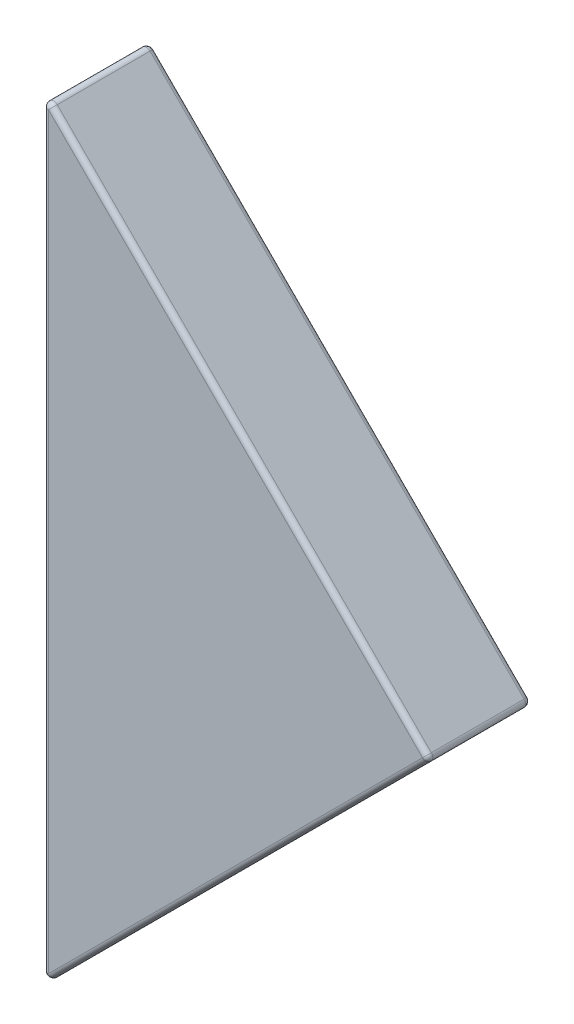
ISO-10303-21;
HEADER;
FILE_DESCRIPTION(('STEP AP214'),'2;1');
FILE_NAME('part.step','',(''),(''),'','','');
FILE_SCHEMA(('AUTOMOTIVE_DESIGN { 1 0 10303 214 1 1 1 1 }'));
ENDSEC;
DATA;
#1=APPLICATION_CONTEXT('core data for automotive mechanical design processes');
#2=APPLICATION_PROTOCOL_DEFINITION('international standard','automotive_design',2000,#1);
#3=PRODUCT_CONTEXT('',#1,'mechanical');
#4=PRODUCT('Part','Part','',(#3));
#5=PRODUCT_RELATED_PRODUCT_CATEGORY('part','',(#4));
#6=PRODUCT_DEFINITION_FORMATION('','',#4);
#7=PRODUCT_DEFINITION_CONTEXT('part definition',#1,'design');
#8=PRODUCT_DEFINITION('design','',#6,#7);
#9=PRODUCT_DEFINITION_SHAPE('','',#8);
#10=(LENGTH_UNIT() NAMED_UNIT(*) SI_UNIT(.MILLI.,.METRE.));
#11=(NAMED_UNIT(*) PLANE_ANGLE_UNIT() SI_UNIT($,.RADIAN.));
#12=(NAMED_UNIT(*) SI_UNIT($,.STERADIAN.) SOLID_ANGLE_UNIT());
#13=UNCERTAINTY_MEASURE_WITH_UNIT(LENGTH_MEASURE(1.E-05),#10,'distance_accuracy_value','');
#14=(GEOMETRIC_REPRESENTATION_CONTEXT(3) GLOBAL_UNCERTAINTY_ASSIGNED_CONTEXT((#13)) GLOBAL_UNIT_ASSIGNED_CONTEXT((#10,
#11,#12)) REPRESENTATION_CONTEXT('',''));
#15=CARTESIAN_POINT('',(0.,0.,0.));
#16=DIRECTION('',(0.,0.,1.));
#17=DIRECTION('',(1.,0.,0.));
#18=AXIS2_PLACEMENT_3D('',#15,#16,#17);
#19=CARTESIAN_POINT('',(0.,0.,10.));
#20=DIRECTION('',(1.,0.,0.));
#21=DIRECTION('',(0.,0.,-1.));
#22=AXIS2_PLACEMENT_3D('',#19,#20,#21);
#23=PLANE('',#22);
#24=DIRECTION('',(0.,-1.,0.));
#25=VECTOR('',#24,1.);
#26=CARTESIAN_POINT('',(0.,0.,0.5));
#27=LINE('',#26,#25);
#28=CARTESIAN_POINT('',(0.,73.7928932188134,0.5));
#29=VERTEX_POINT('',#28);
#30=CARTESIAN_POINT('',(0.,1.20710678118655,0.5));
#31=VERTEX_POINT('',#30);
#32=EDGE_CURVE('E199',#29,#31,#27,.T.);
#33=ORIENTED_EDGE('',*,*,#32,.T.);
#34=DIRECTION('',(0.,0.,-1.));
#35=VECTOR('',#34,1.);
#36=CARTESIAN_POINT('',(0.,1.20710678118655,10.));
#37=LINE('',#36,#35);
#38=CARTESIAN_POINT('',(0.,1.20710678118655,9.5));
#39=VERTEX_POINT('',#38);
#40=EDGE_CURVE('E201',#31,#39,#37,.F.);
#41=ORIENTED_EDGE('',*,*,#40,.T.);
#42=DIRECTION('',(0.,-1.,0.));
#43=VECTOR('',#42,1.);
#44=CARTESIAN_POINT('',(0.,0.,9.5));
#45=LINE('',#44,#43);
#46=CARTESIAN_POINT('',(0.,73.7928932188134,9.5));
#47=VERTEX_POINT('',#46);
#48=EDGE_CURVE('E178',#39,#47,#45,.F.);
#49=ORIENTED_EDGE('',*,*,#48,.T.);
#50=DIRECTION('',(0.,0.,-1.));
#51=VECTOR('',#50,1.);
#52=CARTESIAN_POINT('',(0.,73.7928932188134,10.));
#53=LINE('',#52,#51);
#54=EDGE_CURVE('E196',#47,#29,#53,.T.);
#55=ORIENTED_EDGE('',*,*,#54,.T.);
#56=EDGE_LOOP('',(#33,#41,#49,#55));
#57=FACE_BOUND('',#56,.T.);
#58=ADVANCED_FACE('F33',(#57),#23,.F.);
#59=CARTESIAN_POINT('',(37.5,37.5000000000001,10.));
#60=DIRECTION('',(-0.707106781186548,0.707106781186547,0.));
#61=DIRECTION('',(-0.707106781186547,-0.707106781186548,0.));
#62=AXIS2_PLACEMENT_3D('',#59,#60,#61);
#63=PLANE('',#62);
#64=DIRECTION('',(0.707106781186547,0.707106781186548,0.));
#65=VECTOR('',#64,1.);
#66=CARTESIAN_POINT('',(37.5,37.5000000000001,9.5));
#67=LINE('',#66,#65);
#68=CARTESIAN_POINT('',(37.1464466094067,37.1464466094068,9.5));
#69=VERTEX_POINT('',#68);
#70=CARTESIAN_POINT('',(0.853553390593274,0.85355339059328,9.5));
#71=VERTEX_POINT('',#70);
#72=EDGE_CURVE('E118',#69,#71,#67,.F.);
#73=ORIENTED_EDGE('',*,*,#72,.T.);
#74=DIRECTION('',(0.,0.,-1.));
#75=VECTOR('',#74,1.);
#76=CARTESIAN_POINT('',(0.853553390593273,0.85355339059328,10.));
#77=LINE('',#76,#75);
#78=CARTESIAN_POINT('',(0.853553390593274,0.85355339059328,0.5));
#79=VERTEX_POINT('',#78);
#80=EDGE_CURVE('E114',#71,#79,#77,.T.);
#81=ORIENTED_EDGE('',*,*,#80,.T.);
#82=DIRECTION('',(0.707106781186547,0.707106781186548,0.));
#83=VECTOR('',#82,1.);
#84=CARTESIAN_POINT('',(37.5,37.5000000000001,0.5));
#85=LINE('',#84,#83);
#86=CARTESIAN_POINT('',(37.1464466094067,37.1464466094068,0.5));
#87=VERTEX_POINT('',#86);
#88=EDGE_CURVE('E108',#79,#87,#85,.T.);
#89=ORIENTED_EDGE('',*,*,#88,.T.);
#90=DIRECTION('',(0.,0.,-1.));
#91=VECTOR('',#90,1.);
#92=CARTESIAN_POINT('',(37.1464466094067,37.1464466094068,10.));
#93=LINE('',#92,#91);
#94=EDGE_CURVE('E111',#87,#69,#93,.F.);
#95=ORIENTED_EDGE('',*,*,#94,.T.);
#96=EDGE_LOOP('',(#73,#81,#89,#95));
#97=FACE_BOUND('',#96,.T.);
#98=ADVANCED_FACE('F110',(#97),#63,.F.);
#99=CARTESIAN_POINT('',(0.,75.,10.));
#100=DIRECTION('',(-0.707106781186547,-0.707106781186548,0.));
#101=DIRECTION('',(0.707106781186548,-0.707106781186547,0.));
#102=AXIS2_PLACEMENT_3D('',#99,#100,#101);
#103=PLANE('',#102);
#104=DIRECTION('',(-0.707106781186548,0.707106781186547,0.));
#105=VECTOR('',#104,1.);
#106=CARTESIAN_POINT('',(0.,75.,0.5));
#107=LINE('',#106,#105);
#108=CARTESIAN_POINT('',(37.1464466094067,37.8535533905933,0.5));
#109=VERTEX_POINT('',#108);
#110=CARTESIAN_POINT('',(0.853553390593274,74.1464466094067,0.5));
#111=VERTEX_POINT('',#110);
#112=EDGE_CURVE('E212',#109,#111,#107,.T.);
#113=ORIENTED_EDGE('',*,*,#112,.T.);
#114=DIRECTION('',(0.,0.,-1.));
#115=VECTOR('',#114,1.);
#116=CARTESIAN_POINT('',(0.853553390593274,74.1464466094067,10.));
#117=LINE('',#116,#115);
#118=CARTESIAN_POINT('',(0.853553390593274,74.1464466094067,9.5));
#119=VERTEX_POINT('',#118);
#120=EDGE_CURVE('E187',#111,#119,#117,.F.);
#121=ORIENTED_EDGE('',*,*,#120,.T.);
#122=DIRECTION('',(-0.707106781186548,0.707106781186547,0.));
#123=VECTOR('',#122,1.);
#124=CARTESIAN_POINT('',(0.,75.,9.5));
#125=LINE('',#124,#123);
#126=CARTESIAN_POINT('',(37.1464466094067,37.8535533905933,9.5));
#127=VERTEX_POINT('',#126);
#128=EDGE_CURVE('E210',#119,#127,#125,.F.);
#129=ORIENTED_EDGE('',*,*,#128,.T.);
#130=DIRECTION('',(0.,0.,-1.));
#131=VECTOR('',#130,1.);
#132=CARTESIAN_POINT('',(37.1464466094067,37.8535533905933,10.));
#133=LINE('',#132,#131);
#134=EDGE_CURVE('E208',#127,#109,#133,.T.);
#135=ORIENTED_EDGE('',*,*,#134,.T.);
#136=EDGE_LOOP('',(#113,#121,#129,#135));
#137=FACE_BOUND('',#136,.T.);
#138=ADVANCED_FACE('F246',(#137),#103,.F.);
#139=CARTESIAN_POINT('',(0.,0.,10.));
#140=DIRECTION('',(0.,0.,-1.));
#141=DIRECTION('',(-1.,0.,0.));
#142=AXIS2_PLACEMENT_3D('',#139,#140,#141);
#143=PLANE('',#142);
#144=DIRECTION('',(-0.707106781186548,0.707106781186547,0.));
#145=VECTOR('',#144,1.);
#146=CARTESIAN_POINT('',(37.1464466094067,37.1464466094068,10.));
#147=LINE('',#146,#145);
#148=CARTESIAN_POINT('',(36.7928932188135,37.5000000000001,10.));
#149=VERTEX_POINT('',#148);
#150=CARTESIAN_POINT('',(0.500000000000001,73.7928932188134,10.));
#151=VERTEX_POINT('',#150);
#152=EDGE_CURVE('E57',#149,#151,#147,.T.);
#153=ORIENTED_EDGE('',*,*,#152,.T.);
#154=DIRECTION('',(0.,-1.,0.));
#155=VECTOR('',#154,1.);
#156=CARTESIAN_POINT('',(0.5,0.,10.));
#157=LINE('',#156,#155);
#158=CARTESIAN_POINT('',(0.5,1.20710678118655,10.));
#159=VERTEX_POINT('',#158);
#160=EDGE_CURVE('E11',#151,#159,#157,.T.);
#161=ORIENTED_EDGE('',*,*,#160,.T.);
#162=DIRECTION('',(0.707106781186547,0.707106781186548,0.));
#163=VECTOR('',#162,1.);
#164=CARTESIAN_POINT('',(-0.353553390593272,0.353553390593271,10.));
#165=LINE('',#164,#163);
#166=EDGE_CURVE('E42',#159,#149,#165,.T.);
#167=ORIENTED_EDGE('',*,*,#166,.T.);
#168=EDGE_LOOP('',(#153,#161,#167));
#169=FACE_BOUND('',#168,.T.);
#170=ADVANCED_FACE('F181',(#169),#143,.F.);
#171=CARTESIAN_POINT('',(0.,0.,0.));
#172=DIRECTION('',(0.,0.,-1.));
#173=DIRECTION('',(-1.,0.,0.));
#174=AXIS2_PLACEMENT_3D('',#171,#172,#173);
#175=PLANE('',#174);
#176=DIRECTION('',(-0.707106781186548,0.707106781186547,0.));
#177=VECTOR('',#176,1.);
#178=CARTESIAN_POINT('',(37.1464466094067,37.1464466094068,0.));
#179=LINE('',#178,#177);
#180=CARTESIAN_POINT('',(0.5,73.7928932188134,0.));
#181=VERTEX_POINT('',#180);
#182=CARTESIAN_POINT('',(36.7928932188134,37.5000000000001,0.));
#183=VERTEX_POINT('',#182);
#184=EDGE_CURVE('E203',#181,#183,#179,.F.);
#185=ORIENTED_EDGE('',*,*,#184,.T.);
#186=DIRECTION('',(0.707106781186547,0.707106781186548,0.));
#187=VECTOR('',#186,1.);
#188=CARTESIAN_POINT('',(-0.353553390593273,0.353553390593279,0.));
#189=LINE('',#188,#187);
#190=CARTESIAN_POINT('',(0.5,1.20710678118655,0.));
#191=VERTEX_POINT('',#190);
#192=EDGE_CURVE('E141',#183,#191,#189,.F.);
#193=ORIENTED_EDGE('',*,*,#192,.T.);
#194=DIRECTION('',(0.,-1.,0.));
#195=VECTOR('',#194,1.);
#196=CARTESIAN_POINT('',(0.5,75.,0.));
#197=LINE('',#196,#195);
#198=EDGE_CURVE('E205',#191,#181,#197,.F.);
#199=ORIENTED_EDGE('',*,*,#198,.T.);
#200=EDGE_LOOP('',(#185,#193,#199));
#201=FACE_BOUND('',#200,.T.);
#202=ADVANCED_FACE('F240',(#201),#175,.T.);
#203=CARTESIAN_POINT('',(37.1464466094067,37.1464466094068,9.5));
#204=DIRECTION('',(-0.707106781186548,0.707106781186547,0.));
#205=DIRECTION('',(-0.707106781186547,-0.707106781186548,0.));
#206=AXIS2_PLACEMENT_3D('',#203,#204,#205);
#207=CYLINDRICAL_SURFACE('',#206,0.5);
#208=CARTESIAN_POINT('',(36.7928932188134,37.5000000000001,9.5));
#209=DIRECTION('',(0.707106781186547,-0.707106781186547,0.));
#210=DIRECTION('',(0.707106781186548,0.707106781186548,0.));
#211=AXIS2_PLACEMENT_3D('',#208,#209,#210);
#212=CIRCLE('',#211,0.5);
#213=EDGE_CURVE('E162',#127,#149,#212,.T.);
#214=ORIENTED_EDGE('',*,*,#213,.F.);
#215=ORIENTED_EDGE('',*,*,#128,.F.);
#216=CARTESIAN_POINT('',(0.500000000000001,73.7928932188134,9.5));
#217=DIRECTION('',(-0.707106781186547,0.707106781186548,0.));
#218=DIRECTION('',(-0.707106781186548,-0.707106781186547,0.));
#219=AXIS2_PLACEMENT_3D('',#216,#217,#218);
#220=CIRCLE('',#219,0.5);
#221=EDGE_CURVE('E164',#151,#119,#220,.T.);
#222=ORIENTED_EDGE('',*,*,#221,.F.);
#223=ORIENTED_EDGE('',*,*,#152,.F.);
#224=EDGE_LOOP('',(#214,#215,#222,#223));
#225=FACE_BOUND('',#224,.T.);
#226=ADVANCED_FACE('F35',(#225),#207,.T.);
#227=CARTESIAN_POINT('',(36.7928932188134,37.5000000000001,10.));
#228=DIRECTION('',(0.,0.,-1.));
#229=DIRECTION('',(-1.,0.,0.));
#230=AXIS2_PLACEMENT_3D('',#227,#228,#229);
#231=CYLINDRICAL_SURFACE('',#230,0.5);
#232=CARTESIAN_POINT('',(36.7928932188134,37.5000000000001,0.5));
#233=DIRECTION('',(0.,0.,-1.));
#234=DIRECTION('',(-1.,0.,0.));
#235=AXIS2_PLACEMENT_3D('',#232,#233,#234);
#236=CIRCLE('',#235,0.5);
#237=EDGE_CURVE('E125',#109,#87,#236,.T.);
#238=ORIENTED_EDGE('',*,*,#237,.F.);
#239=ORIENTED_EDGE('',*,*,#134,.F.);
#240=CARTESIAN_POINT('',(36.7928932188134,37.5000000000001,9.5));
#241=DIRECTION('',(0.,0.,1.));
#242=DIRECTION('',(1.,0.,0.));
#243=AXIS2_PLACEMENT_3D('',#240,#241,#242);
#244=CIRCLE('',#243,0.5);
#245=EDGE_CURVE('E128',#69,#127,#244,.T.);
#246=ORIENTED_EDGE('',*,*,#245,.F.);
#247=ORIENTED_EDGE('',*,*,#94,.F.);
#248=EDGE_LOOP('',(#238,#239,#246,#247));
#249=FACE_BOUND('',#248,.T.);
#250=ADVANCED_FACE('F123',(#249),#231,.T.);
#251=CARTESIAN_POINT('',(-0.353553390593274,74.6464466094067,0.5));
#252=DIRECTION('',(0.707106781186548,-0.707106781186547,0.));
#253=DIRECTION('',(0.707106781186547,0.707106781186548,0.));
#254=AXIS2_PLACEMENT_3D('',#251,#252,#253);
#255=CYLINDRICAL_SURFACE('',#254,0.5);
#256=CARTESIAN_POINT('',(0.5,73.7928932188134,0.5));
#257=DIRECTION('',(-0.707106781186547,0.707106781186548,0.));
#258=DIRECTION('',(-0.707106781186548,-0.707106781186547,0.));
#259=AXIS2_PLACEMENT_3D('',#256,#257,#258);
#260=CIRCLE('',#259,0.5);
#261=EDGE_CURVE('E157',#111,#181,#260,.T.);
#262=ORIENTED_EDGE('',*,*,#261,.F.);
#263=ORIENTED_EDGE('',*,*,#112,.F.);
#264=CARTESIAN_POINT('',(36.7928932188134,37.5000000000001,0.5));
#265=DIRECTION('',(0.707106781186554,-0.707106781186541,0.));
#266=DIRECTION('',(0.707106781186541,0.707106781186554,0.));
#267=AXIS2_PLACEMENT_3D('',#264,#265,#266);
#268=CIRCLE('',#267,0.5);
#269=EDGE_CURVE('E137',#183,#109,#268,.T.);
#270=ORIENTED_EDGE('',*,*,#269,.F.);
#271=ORIENTED_EDGE('',*,*,#184,.F.);
#272=EDGE_LOOP('',(#262,#263,#270,#271));
#273=FACE_BOUND('',#272,.T.);
#274=ADVANCED_FACE('F244',(#273),#255,.T.);
#275=CARTESIAN_POINT('',(0.5,73.7928932188134,10.));
#276=DIRECTION('',(0.,0.,-1.));
#277=DIRECTION('',(-1.,0.,0.));
#278=AXIS2_PLACEMENT_3D('',#275,#276,#277);
#279=CYLINDRICAL_SURFACE('',#278,0.5);
#280=CARTESIAN_POINT('',(0.5,73.7928932188134,9.5));
#281=DIRECTION('',(0.,0.,1.));
#282=DIRECTION('',(1.,0.,0.));
#283=AXIS2_PLACEMENT_3D('',#280,#281,#282);
#284=CIRCLE('',#283,0.5);
#285=EDGE_CURVE('E37',#119,#47,#284,.T.);
#286=ORIENTED_EDGE('',*,*,#285,.F.);
#287=ORIENTED_EDGE('',*,*,#120,.F.);
#288=CARTESIAN_POINT('',(0.5,73.7928932188134,0.5));
#289=DIRECTION('',(0.,0.,-1.));
#290=DIRECTION('',(-1.,0.,0.));
#291=AXIS2_PLACEMENT_3D('',#288,#289,#290);
#292=CIRCLE('',#291,0.5);
#293=EDGE_CURVE('E155',#29,#111,#292,.T.);
#294=ORIENTED_EDGE('',*,*,#293,.F.);
#295=ORIENTED_EDGE('',*,*,#54,.F.);
#296=EDGE_LOOP('',(#286,#287,#294,#295));
#297=FACE_BOUND('',#296,.T.);
#298=ADVANCED_FACE('F248',(#297),#279,.T.);
#299=CARTESIAN_POINT('',(0.5,73.7928932188134,9.5));
#300=DIRECTION('',(0.,0.,1.));
#301=DIRECTION('',(1.,0.,0.));
#302=AXIS2_PLACEMENT_3D('',#299,#300,#301);
#303=SPHERICAL_SURFACE('',#302,0.5);
#304=ORIENTED_EDGE('',*,*,#221,.T.);
#305=ORIENTED_EDGE('',*,*,#285,.T.);
#306=CARTESIAN_POINT('',(0.5,73.7928932188134,9.5));
#307=DIRECTION('',(0.,1.,0.));
#308=DIRECTION('',(0.,0.,1.));
#309=AXIS2_PLACEMENT_3D('',#306,#307,#308);
#310=CIRCLE('',#309,0.5);
#311=EDGE_CURVE('E146',#151,#47,#310,.F.);
#312=ORIENTED_EDGE('',*,*,#311,.F.);
#313=EDGE_LOOP('',(#304,#305,#312));
#314=FACE_BOUND('',#313,.T.);
#315=ADVANCED_FACE('F170',(#314),#303,.T.);
#316=CARTESIAN_POINT('',(36.7928932188134,37.5000000000001,9.5));
#317=DIRECTION('',(0.,0.,1.));
#318=DIRECTION('',(1.,0.,0.));
#319=AXIS2_PLACEMENT_3D('',#316,#317,#318);
#320=SPHERICAL_SURFACE('',#319,0.5);
#321=ORIENTED_EDGE('',*,*,#245,.T.);
#322=ORIENTED_EDGE('',*,*,#213,.T.);
#323=CARTESIAN_POINT('',(36.7928932188135,37.5000000000001,9.5));
#324=DIRECTION('',(0.707106781186548,0.707106781186548,0.));
#325=DIRECTION('',(-0.707106781186548,0.707106781186548,0.));
#326=AXIS2_PLACEMENT_3D('',#323,#324,#325);
#327=CIRCLE('',#326,0.5);
#328=EDGE_CURVE('E142',#69,#149,#327,.F.);
#329=ORIENTED_EDGE('',*,*,#328,.F.);
#330=EDGE_LOOP('',(#321,#322,#329));
#331=FACE_BOUND('',#330,.T.);
#332=ADVANCED_FACE('F190',(#331),#320,.T.);
#333=CARTESIAN_POINT('',(36.7928932188134,37.5000000000001,0.5));
#334=DIRECTION('',(0.,0.,1.));
#335=DIRECTION('',(1.,0.,0.));
#336=AXIS2_PLACEMENT_3D('',#333,#334,#335);
#337=SPHERICAL_SURFACE('',#336,0.5);
#338=ORIENTED_EDGE('',*,*,#269,.T.);
#339=ORIENTED_EDGE('',*,*,#237,.T.);
#340=CARTESIAN_POINT('',(36.7928932188134,37.5000000000001,0.5));
#341=DIRECTION('',(0.707106781186547,0.707106781186547,0.));
#342=DIRECTION('',(-0.707106781186548,0.707106781186548,0.));
#343=AXIS2_PLACEMENT_3D('',#340,#341,#342);
#344=CIRCLE('',#343,0.5);
#345=EDGE_CURVE('E134',#183,#87,#344,.F.);
#346=ORIENTED_EDGE('',*,*,#345,.F.);
#347=EDGE_LOOP('',(#338,#339,#346));
#348=FACE_BOUND('',#347,.T.);
#349=ADVANCED_FACE('F133',(#348),#337,.T.);
#350=CARTESIAN_POINT('',(0.5,73.7928932188134,0.5));
#351=DIRECTION('',(0.,0.,1.));
#352=DIRECTION('',(1.,0.,0.));
#353=AXIS2_PLACEMENT_3D('',#350,#351,#352);
#354=SPHERICAL_SURFACE('',#353,0.5);
#355=ORIENTED_EDGE('',*,*,#293,.T.);
#356=ORIENTED_EDGE('',*,*,#261,.T.);
#357=CARTESIAN_POINT('',(0.5,73.7928932188134,0.5));
#358=DIRECTION('',(0.,1.,0.));
#359=DIRECTION('',(0.,0.,1.));
#360=AXIS2_PLACEMENT_3D('',#357,#358,#359);
#361=CIRCLE('',#360,0.5);
#362=EDGE_CURVE('E143',#29,#181,#361,.F.);
#363=ORIENTED_EDGE('',*,*,#362,.F.);
#364=EDGE_LOOP('',(#355,#356,#363));
#365=FACE_BOUND('',#364,.T.);
#366=ADVANCED_FACE('F250',(#365),#354,.T.);
#367=CARTESIAN_POINT('',(0.5,0.,9.5));
#368=DIRECTION('',(0.,-1.,0.));
#369=DIRECTION('',(0.,0.,-1.));
#370=AXIS2_PLACEMENT_3D('',#367,#368,#369);
#371=CYLINDRICAL_SURFACE('',#370,0.5);
#372=ORIENTED_EDGE('',*,*,#311,.T.);
#373=ORIENTED_EDGE('',*,*,#48,.F.);
#374=CARTESIAN_POINT('',(0.5,1.20710678118655,9.5));
#375=DIRECTION('',(0.,-1.,0.));
#376=DIRECTION('',(1.,0.,0.));
#377=AXIS2_PLACEMENT_3D('',#374,#375,#376);
#378=CIRCLE('',#377,0.5);
#379=EDGE_CURVE('E149',#159,#39,#378,.T.);
#380=ORIENTED_EDGE('',*,*,#379,.F.);
#381=ORIENTED_EDGE('',*,*,#160,.F.);
#382=EDGE_LOOP('',(#372,#373,#380,#381));
#383=FACE_BOUND('',#382,.T.);
#384=ADVANCED_FACE('F177',(#383),#371,.T.);
#385=CARTESIAN_POINT('',(-0.353553390593274,0.353553390593274,9.5));
#386=DIRECTION('',(0.707106781186547,0.707106781186548,0.));
#387=DIRECTION('',(-0.707106781186548,0.707106781186547,0.));
#388=AXIS2_PLACEMENT_3D('',#385,#386,#387);
#389=CYLINDRICAL_SURFACE('',#388,0.5);
#390=ORIENTED_EDGE('',*,*,#328,.T.);
#391=ORIENTED_EDGE('',*,*,#166,.F.);
#392=CARTESIAN_POINT('',(0.499999999999999,1.20710678118655,9.5));
#393=DIRECTION('',(-0.707106781186547,-0.707106781186548,0.));
#394=DIRECTION('',(0.707106781186548,-0.707106781186547,0.));
#395=AXIS2_PLACEMENT_3D('',#392,#393,#394);
#396=CIRCLE('',#395,0.5);
#397=EDGE_CURVE('E50',#71,#159,#396,.T.);
#398=ORIENTED_EDGE('',*,*,#397,.F.);
#399=ORIENTED_EDGE('',*,*,#72,.F.);
#400=EDGE_LOOP('',(#390,#391,#398,#399));
#401=FACE_BOUND('',#400,.T.);
#402=ADVANCED_FACE('F192',(#401),#389,.T.);
#403=CARTESIAN_POINT('',(37.1464466094067,37.8535533905933,0.5));
#404=DIRECTION('',(-0.707106781186547,-0.707106781186548,0.));
#405=DIRECTION('',(0.707106781186548,-0.707106781186547,0.));
#406=AXIS2_PLACEMENT_3D('',#403,#404,#405);
#407=CYLINDRICAL_SURFACE('',#406,0.5);
#408=ORIENTED_EDGE('',*,*,#345,.T.);
#409=ORIENTED_EDGE('',*,*,#88,.F.);
#410=CARTESIAN_POINT('',(0.5,1.20710678118655,0.5));
#411=DIRECTION('',(-0.707106781186548,-0.707106781186547,0.));
#412=DIRECTION('',(0.707106781186547,-0.707106781186548,0.));
#413=AXIS2_PLACEMENT_3D('',#410,#411,#412);
#414=CIRCLE('',#413,0.5);
#415=EDGE_CURVE('E222',#191,#79,#414,.T.);
#416=ORIENTED_EDGE('',*,*,#415,.F.);
#417=ORIENTED_EDGE('',*,*,#192,.F.);
#418=EDGE_LOOP('',(#408,#409,#416,#417));
#419=FACE_BOUND('',#418,.T.);
#420=ADVANCED_FACE('F139',(#419),#407,.T.);
#421=CARTESIAN_POINT('',(0.5,0.,0.5));
#422=DIRECTION('',(0.,1.,0.));
#423=DIRECTION('',(0.,0.,1.));
#424=AXIS2_PLACEMENT_3D('',#421,#422,#423);
#425=CYLINDRICAL_SURFACE('',#424,0.5);
#426=ORIENTED_EDGE('',*,*,#362,.T.);
#427=ORIENTED_EDGE('',*,*,#198,.F.);
#428=CARTESIAN_POINT('',(0.5,1.20710678118655,0.5));
#429=DIRECTION('',(0.,-1.,0.));
#430=DIRECTION('',(0.,0.,-1.));
#431=AXIS2_PLACEMENT_3D('',#428,#429,#430);
#432=CIRCLE('',#431,0.5);
#433=EDGE_CURVE('E220',#31,#191,#432,.T.);
#434=ORIENTED_EDGE('',*,*,#433,.F.);
#435=ORIENTED_EDGE('',*,*,#32,.F.);
#436=EDGE_LOOP('',(#426,#427,#434,#435));
#437=FACE_BOUND('',#436,.T.);
#438=ADVANCED_FACE('F235',(#437),#425,.T.);
#439=CARTESIAN_POINT('',(0.5,1.20710678118655,9.5));
#440=DIRECTION('',(0.,0.,1.));
#441=DIRECTION('',(1.,0.,0.));
#442=AXIS2_PLACEMENT_3D('',#439,#440,#441);
#443=SPHERICAL_SURFACE('',#442,0.5);
#444=ORIENTED_EDGE('',*,*,#397,.T.);
#445=ORIENTED_EDGE('',*,*,#379,.T.);
#446=CARTESIAN_POINT('',(0.5,1.20710678118655,9.5));
#447=DIRECTION('',(0.,0.,1.));
#448=DIRECTION('',(1.,0.,0.));
#449=AXIS2_PLACEMENT_3D('',#446,#447,#448);
#450=CIRCLE('',#449,0.5);
#451=EDGE_CURVE('E218',#71,#39,#450,.F.);
#452=ORIENTED_EDGE('',*,*,#451,.F.);
#453=EDGE_LOOP('',(#444,#445,#452));
#454=FACE_BOUND('',#453,.T.);
#455=ADVANCED_FACE('F225',(#454),#443,.T.);
#456=CARTESIAN_POINT('',(0.5,1.20710678118655,0.5));
#457=DIRECTION('',(0.,0.,1.));
#458=DIRECTION('',(1.,0.,0.));
#459=AXIS2_PLACEMENT_3D('',#456,#457,#458);
#460=SPHERICAL_SURFACE('',#459,0.5);
#461=ORIENTED_EDGE('',*,*,#433,.T.);
#462=ORIENTED_EDGE('',*,*,#415,.T.);
#463=CARTESIAN_POINT('',(0.499999999999999,1.20710678118655,0.5));
#464=DIRECTION('',(0.,0.,-1.));
#465=DIRECTION('',(-1.,0.,0.));
#466=AXIS2_PLACEMENT_3D('',#463,#464,#465);
#467=CIRCLE('',#466,0.5);
#468=EDGE_CURVE('E216',#31,#79,#467,.F.);
#469=ORIENTED_EDGE('',*,*,#468,.F.);
#470=EDGE_LOOP('',(#461,#462,#469));
#471=FACE_BOUND('',#470,.T.);
#472=ADVANCED_FACE('F231',(#471),#460,.T.);
#473=CARTESIAN_POINT('',(0.5,1.20710678118655,10.));
#474=DIRECTION('',(0.,0.,-1.));
#475=DIRECTION('',(-1.,0.,0.));
#476=AXIS2_PLACEMENT_3D('',#473,#474,#475);
#477=CYLINDRICAL_SURFACE('',#476,0.5);
#478=ORIENTED_EDGE('',*,*,#451,.T.);
#479=ORIENTED_EDGE('',*,*,#40,.F.);
#480=ORIENTED_EDGE('',*,*,#468,.T.);
#481=ORIENTED_EDGE('',*,*,#80,.F.);
#482=EDGE_LOOP('',(#478,#479,#480,#481));
#483=FACE_BOUND('',#482,.T.);
#484=ADVANCED_FACE('F228',(#483),#477,.T.);
#485=CLOSED_SHELL('',(#58,#98,#138,#170,#202,#226,#250,#274,#298,#315,#332,#349,#366,#384,#402,
#420,#438,#455,#472,#484));
#486=MANIFOLD_SOLID_BREP('B2',#485);
#487=ADVANCED_BREP_SHAPE_REPRESENTATION('',(#18,#486),#14);
#488=SHAPE_DEFINITION_REPRESENTATION(#9,#487);
ENDSEC;
END-ISO-10303-21;
